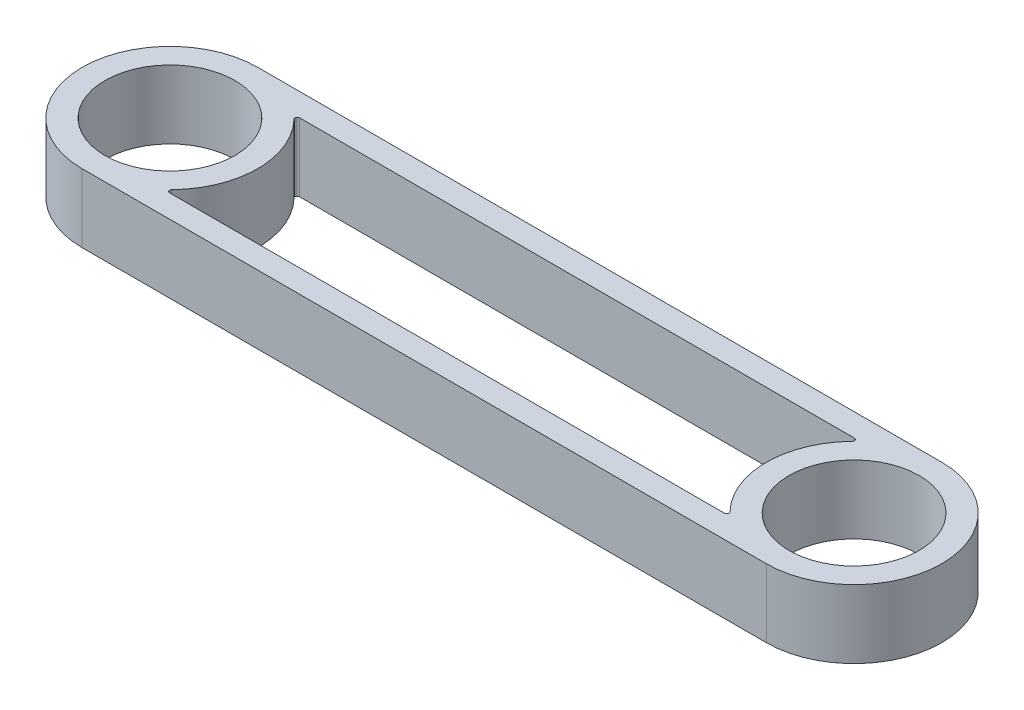
ISO-10303-21;
HEADER;
FILE_DESCRIPTION(('STEP AP214'),'2;1');
FILE_NAME('part.step','',(''),(''),'','','');
FILE_SCHEMA(('AUTOMOTIVE_DESIGN { 1 0 10303 214 1 1 1 1 }'));
ENDSEC;
DATA;
#1=APPLICATION_CONTEXT('core data for automotive mechanical design processes');
#2=APPLICATION_PROTOCOL_DEFINITION('international standard','automotive_design',2000,#1);
#3=PRODUCT_CONTEXT('',#1,'mechanical');
#4=PRODUCT('Part','Part','',(#3));
#5=PRODUCT_RELATED_PRODUCT_CATEGORY('part','',(#4));
#6=PRODUCT_DEFINITION_FORMATION('','',#4);
#7=PRODUCT_DEFINITION_CONTEXT('part definition',#1,'design');
#8=PRODUCT_DEFINITION('design','',#6,#7);
#9=PRODUCT_DEFINITION_SHAPE('','',#8);
#10=(LENGTH_UNIT() NAMED_UNIT(*) SI_UNIT(.MILLI.,.METRE.));
#11=(NAMED_UNIT(*) PLANE_ANGLE_UNIT() SI_UNIT($,.RADIAN.));
#12=(NAMED_UNIT(*) SI_UNIT($,.STERADIAN.) SOLID_ANGLE_UNIT());
#13=UNCERTAINTY_MEASURE_WITH_UNIT(LENGTH_MEASURE(1.E-05),#10,'distance_accuracy_value','');
#14=(GEOMETRIC_REPRESENTATION_CONTEXT(3) GLOBAL_UNCERTAINTY_ASSIGNED_CONTEXT((#13)) GLOBAL_UNIT_ASSIGNED_CONTEXT((#10,
#11,#12)) REPRESENTATION_CONTEXT('',''));
#15=CARTESIAN_POINT('',(0.,0.,0.));
#16=DIRECTION('',(0.,0.,1.));
#17=DIRECTION('',(1.,0.,0.));
#18=AXIS2_PLACEMENT_3D('',#15,#16,#17);
#19=CARTESIAN_POINT('',(0.,30.,0.));
#20=DIRECTION('',(0.,1.,0.));
#21=DIRECTION('',(0.,0.,1.));
#22=AXIS2_PLACEMENT_3D('',#19,#20,#21);
#23=PLANE('',#22);
#24=CARTESIAN_POINT('',(0.,30.,0.));
#25=DIRECTION('',(0.,-1.,0.));
#26=DIRECTION('',(0.,0.,1.));
#27=AXIS2_PLACEMENT_3D('',#24,#25,#26);
#28=CIRCLE('',#27,38.5);
#29=CARTESIAN_POINT('',(27.637048345933,30.,-26.8037974683544));
#30=VERTEX_POINT('',#29);
#31=CARTESIAN_POINT('',(27.637048345933,30.,26.8037974683544));
#32=VERTEX_POINT('',#31);
#33=EDGE_CURVE('E132',#30,#32,#28,.T.);
#34=ORIENTED_EDGE('',*,*,#33,.F.);
#35=CARTESIAN_POINT('',(28.3548937575157,30.,-27.5));
#36=DIRECTION('',(0.,1.,0.));
#37=DIRECTION('',(0.,0.,1.));
#38=AXIS2_PLACEMENT_3D('',#35,#36,#37);
#39=CIRCLE('',#38,1.);
#40=CARTESIAN_POINT('',(28.3548937575157,30.,-28.5));
#41=VERTEX_POINT('',#40);
#42=EDGE_CURVE('E124',#41,#30,#39,.T.);
#43=ORIENTED_EDGE('',*,*,#42,.F.);
#44=DIRECTION('',(-1.,0.,0.));
#45=VECTOR('',#44,1.);
#46=CARTESIAN_POINT('',(28.3548937575157,30.,-28.5));
#47=LINE('',#46,#45);
#48=CARTESIAN_POINT('',(271.645106242484,30.,-28.5));
#49=VERTEX_POINT('',#48);
#50=EDGE_CURVE('E159',#49,#41,#47,.T.);
#51=ORIENTED_EDGE('',*,*,#50,.F.);
#52=CARTESIAN_POINT('',(271.645106242484,30.,-27.5));
#53=DIRECTION('',(0.,1.,0.));
#54=DIRECTION('',(0.,0.,-1.));
#55=AXIS2_PLACEMENT_3D('',#52,#53,#54);
#56=CIRCLE('',#55,0.999999999999994);
#57=CARTESIAN_POINT('',(272.362951654067,30.,-26.8037974683544));
#58=VERTEX_POINT('',#57);
#59=EDGE_CURVE('E157',#58,#49,#56,.T.);
#60=ORIENTED_EDGE('',*,*,#59,.F.);
#61=CARTESIAN_POINT('',(300.,30.,0.));
#62=DIRECTION('',(0.,-1.,0.));
#63=DIRECTION('',(0.,0.,-1.));
#64=AXIS2_PLACEMENT_3D('',#61,#62,#63);
#65=CIRCLE('',#64,38.5);
#66=CARTESIAN_POINT('',(272.362951654067,30.,26.8037974683544));
#67=VERTEX_POINT('',#66);
#68=EDGE_CURVE('E155',#67,#58,#65,.T.);
#69=ORIENTED_EDGE('',*,*,#68,.F.);
#70=CARTESIAN_POINT('',(271.645106242484,30.,27.5));
#71=DIRECTION('',(0.,1.,0.));
#72=DIRECTION('',(0.,0.,-1.));
#73=AXIS2_PLACEMENT_3D('',#70,#71,#72);
#74=CIRCLE('',#73,0.999999999999994);
#75=CARTESIAN_POINT('',(271.645106242484,30.,28.5));
#76=VERTEX_POINT('',#75);
#77=EDGE_CURVE('E153',#76,#67,#74,.T.);
#78=ORIENTED_EDGE('',*,*,#77,.F.);
#79=DIRECTION('',(1.,0.,0.));
#80=VECTOR('',#79,1.);
#81=CARTESIAN_POINT('',(28.3548937575157,30.,28.5));
#82=LINE('',#81,#80);
#83=CARTESIAN_POINT('',(28.3548937575157,30.,28.5));
#84=VERTEX_POINT('',#83);
#85=EDGE_CURVE('E148',#84,#76,#82,.T.);
#86=ORIENTED_EDGE('',*,*,#85,.F.);
#87=CARTESIAN_POINT('',(28.3548937575157,30.,27.5));
#88=DIRECTION('',(0.,1.,0.));
#89=DIRECTION('',(0.,0.,1.));
#90=AXIS2_PLACEMENT_3D('',#87,#88,#89);
#91=CIRCLE('',#90,1.);
#92=EDGE_CURVE('E146',#32,#84,#91,.T.);
#93=ORIENTED_EDGE('',*,*,#92,.F.);
#94=EDGE_LOOP('',(#34,#43,#51,#60,#69,#78,#86,#93));
#95=FACE_BOUND('',#94,.T.);
#96=CARTESIAN_POINT('',(0.,30.,0.));
#97=DIRECTION('',(0.,1.,0.));
#98=DIRECTION('',(0.,0.,1.));
#99=AXIS2_PLACEMENT_3D('',#96,#97,#98);
#100=CIRCLE('',#99,28.5);
#101=CARTESIAN_POINT('',(0.,30.,28.5));
#102=VERTEX_POINT('',#101);
#103=EDGE_CURVE('E192',#102,#102,#100,.T.);
#104=ORIENTED_EDGE('',*,*,#103,.F.);
#105=EDGE_LOOP('',(#104));
#106=FACE_BOUND('',#105,.T.);
#107=CARTESIAN_POINT('',(0.,30.,0.));
#108=DIRECTION('',(0.,1.,0.));
#109=DIRECTION('',(0.,0.,1.));
#110=AXIS2_PLACEMENT_3D('',#107,#108,#109);
#111=CIRCLE('',#110,38.5);
#112=CARTESIAN_POINT('',(0.,30.,-38.5));
#113=VERTEX_POINT('',#112);
#114=CARTESIAN_POINT('',(0.,30.,38.5));
#115=VERTEX_POINT('',#114);
#116=EDGE_CURVE('E198',#113,#115,#111,.T.);
#117=ORIENTED_EDGE('',*,*,#116,.T.);
#118=DIRECTION('',(1.,0.,0.));
#119=VECTOR('',#118,1.);
#120=CARTESIAN_POINT('',(0.,30.,38.5));
#121=LINE('',#120,#119);
#122=CARTESIAN_POINT('',(300.,30.,38.5));
#123=VERTEX_POINT('',#122);
#124=EDGE_CURVE('E201',#115,#123,#121,.T.);
#125=ORIENTED_EDGE('',*,*,#124,.T.);
#126=CARTESIAN_POINT('',(300.,30.,0.));
#127=DIRECTION('',(0.,1.,0.));
#128=DIRECTION('',(0.,0.,-1.));
#129=AXIS2_PLACEMENT_3D('',#126,#127,#128);
#130=CIRCLE('',#129,38.5);
#131=CARTESIAN_POINT('',(300.,30.,-38.5000000000001));
#132=VERTEX_POINT('',#131);
#133=EDGE_CURVE('E204',#123,#132,#130,.T.);
#134=ORIENTED_EDGE('',*,*,#133,.T.);
#135=DIRECTION('',(-1.,0.,0.));
#136=VECTOR('',#135,1.);
#137=CARTESIAN_POINT('',(0.,30.,-38.5));
#138=LINE('',#137,#136);
#139=EDGE_CURVE('E206',#132,#113,#138,.T.);
#140=ORIENTED_EDGE('',*,*,#139,.T.);
#141=EDGE_LOOP('',(#117,#125,#134,#140));
#142=FACE_BOUND('',#141,.T.);
#143=CARTESIAN_POINT('',(300.,30.,0.));
#144=DIRECTION('',(0.,1.,0.));
#145=DIRECTION('',(0.,0.,-1.));
#146=AXIS2_PLACEMENT_3D('',#143,#144,#145);
#147=CIRCLE('',#146,28.5);
#148=CARTESIAN_POINT('',(300.,30.,-28.5000000000001));
#149=VERTEX_POINT('',#148);
#150=EDGE_CURVE('E162',#149,#149,#147,.T.);
#151=ORIENTED_EDGE('',*,*,#150,.F.);
#152=EDGE_LOOP('',(#151));
#153=FACE_BOUND('',#152,.T.);
#154=ADVANCED_FACE('F35',(#95,#106,#142,#153),#23,.T.);
#155=CARTESIAN_POINT('',(0.,0.,0.));
#156=DIRECTION('',(0.,1.,0.));
#157=DIRECTION('',(0.,0.,1.));
#158=AXIS2_PLACEMENT_3D('',#155,#156,#157);
#159=PLANE('',#158);
#160=CARTESIAN_POINT('',(0.,0.,0.));
#161=DIRECTION('',(0.,1.,0.));
#162=DIRECTION('',(0.,0.,1.));
#163=AXIS2_PLACEMENT_3D('',#160,#161,#162);
#164=CIRCLE('',#163,28.5);
#165=CARTESIAN_POINT('',(0.,0.,28.5));
#166=VERTEX_POINT('',#165);
#167=EDGE_CURVE('E140',#166,#166,#164,.T.);
#168=ORIENTED_EDGE('',*,*,#167,.T.);
#169=EDGE_LOOP('',(#168));
#170=FACE_BOUND('',#169,.T.);
#171=CARTESIAN_POINT('',(0.,0.,0.));
#172=DIRECTION('',(0.,1.,0.));
#173=DIRECTION('',(0.,0.,1.));
#174=AXIS2_PLACEMENT_3D('',#171,#172,#173);
#175=CIRCLE('',#174,38.5);
#176=CARTESIAN_POINT('',(0.,0.,-38.5));
#177=VERTEX_POINT('',#176);
#178=CARTESIAN_POINT('',(0.,0.,38.5));
#179=VERTEX_POINT('',#178);
#180=EDGE_CURVE('E195',#177,#179,#175,.T.);
#181=ORIENTED_EDGE('',*,*,#180,.F.);
#182=DIRECTION('',(-1.,0.,0.));
#183=VECTOR('',#182,1.);
#184=CARTESIAN_POINT('',(0.,0.,-38.5));
#185=LINE('',#184,#183);
#186=CARTESIAN_POINT('',(300.,0.,-38.5000000000001));
#187=VERTEX_POINT('',#186);
#188=EDGE_CURVE('E202',#187,#177,#185,.T.);
#189=ORIENTED_EDGE('',*,*,#188,.F.);
#190=CARTESIAN_POINT('',(300.,0.,0.));
#191=DIRECTION('',(0.,1.,0.));
#192=DIRECTION('',(0.,0.,-1.));
#193=AXIS2_PLACEMENT_3D('',#190,#191,#192);
#194=CIRCLE('',#193,38.5);
#195=CARTESIAN_POINT('',(300.,0.,38.5));
#196=VERTEX_POINT('',#195);
#197=EDGE_CURVE('E213',#196,#187,#194,.T.);
#198=ORIENTED_EDGE('',*,*,#197,.F.);
#199=DIRECTION('',(1.,0.,0.));
#200=VECTOR('',#199,1.);
#201=CARTESIAN_POINT('',(0.,0.,38.5));
#202=LINE('',#201,#200);
#203=EDGE_CURVE('E211',#179,#196,#202,.T.);
#204=ORIENTED_EDGE('',*,*,#203,.F.);
#205=EDGE_LOOP('',(#181,#189,#198,#204));
#206=FACE_BOUND('',#205,.T.);
#207=CARTESIAN_POINT('',(28.3548937575157,0.,-27.5));
#208=DIRECTION('',(0.,1.,0.));
#209=DIRECTION('',(0.,0.,1.));
#210=AXIS2_PLACEMENT_3D('',#207,#208,#209);
#211=CIRCLE('',#210,1.);
#212=CARTESIAN_POINT('',(28.3548937575157,0.,-28.5));
#213=VERTEX_POINT('',#212);
#214=CARTESIAN_POINT('',(27.637048345933,0.,-26.8037974683544));
#215=VERTEX_POINT('',#214);
#216=EDGE_CURVE('E58',#213,#215,#211,.T.);
#217=ORIENTED_EDGE('',*,*,#216,.T.);
#218=CARTESIAN_POINT('',(0.,0.,0.));
#219=DIRECTION('',(0.,-1.,0.));
#220=DIRECTION('',(0.,0.,1.));
#221=AXIS2_PLACEMENT_3D('',#218,#219,#220);
#222=CIRCLE('',#221,38.5);
#223=CARTESIAN_POINT('',(27.637048345933,0.,26.8037974683544));
#224=VERTEX_POINT('',#223);
#225=EDGE_CURVE('E139',#215,#224,#222,.T.);
#226=ORIENTED_EDGE('',*,*,#225,.T.);
#227=CARTESIAN_POINT('',(28.3548937575157,0.,27.5));
#228=DIRECTION('',(0.,1.,0.));
#229=DIRECTION('',(0.,0.,1.));
#230=AXIS2_PLACEMENT_3D('',#227,#228,#229);
#231=CIRCLE('',#230,1.);
#232=CARTESIAN_POINT('',(28.3548937575157,0.,28.5));
#233=VERTEX_POINT('',#232);
#234=EDGE_CURVE('E164',#224,#233,#231,.T.);
#235=ORIENTED_EDGE('',*,*,#234,.T.);
#236=DIRECTION('',(1.,0.,0.));
#237=VECTOR('',#236,1.);
#238=CARTESIAN_POINT('',(28.3548937575157,0.,28.5));
#239=LINE('',#238,#237);
#240=CARTESIAN_POINT('',(271.645106242484,0.,28.5));
#241=VERTEX_POINT('',#240);
#242=EDGE_CURVE('E167',#233,#241,#239,.T.);
#243=ORIENTED_EDGE('',*,*,#242,.T.);
#244=CARTESIAN_POINT('',(271.645106242484,0.,27.5));
#245=DIRECTION('',(0.,1.,0.));
#246=DIRECTION('',(0.,0.,-1.));
#247=AXIS2_PLACEMENT_3D('',#244,#245,#246);
#248=CIRCLE('',#247,0.999999999999994);
#249=CARTESIAN_POINT('',(272.362951654067,0.,26.8037974683544));
#250=VERTEX_POINT('',#249);
#251=EDGE_CURVE('E170',#241,#250,#248,.T.);
#252=ORIENTED_EDGE('',*,*,#251,.T.);
#253=CARTESIAN_POINT('',(300.,0.,0.));
#254=DIRECTION('',(0.,-1.,0.));
#255=DIRECTION('',(0.,0.,-1.));
#256=AXIS2_PLACEMENT_3D('',#253,#254,#255);
#257=CIRCLE('',#256,38.5);
#258=CARTESIAN_POINT('',(272.362951654067,0.,-26.8037974683544));
#259=VERTEX_POINT('',#258);
#260=EDGE_CURVE('E173',#250,#259,#257,.T.);
#261=ORIENTED_EDGE('',*,*,#260,.T.);
#262=CARTESIAN_POINT('',(271.645106242484,0.,-27.5));
#263=DIRECTION('',(0.,1.,0.));
#264=DIRECTION('',(0.,0.,-1.));
#265=AXIS2_PLACEMENT_3D('',#262,#263,#264);
#266=CIRCLE('',#265,0.999999999999994);
#267=CARTESIAN_POINT('',(271.645106242484,0.,-28.5));
#268=VERTEX_POINT('',#267);
#269=EDGE_CURVE('E176',#259,#268,#266,.T.);
#270=ORIENTED_EDGE('',*,*,#269,.T.);
#271=DIRECTION('',(-1.,0.,0.));
#272=VECTOR('',#271,1.);
#273=CARTESIAN_POINT('',(28.3548937575157,0.,-28.5));
#274=LINE('',#273,#272);
#275=EDGE_CURVE('E133',#268,#213,#274,.T.);
#276=ORIENTED_EDGE('',*,*,#275,.T.);
#277=EDGE_LOOP('',(#217,#226,#235,#243,#252,#261,#270,#276));
#278=FACE_BOUND('',#277,.T.);
#279=CARTESIAN_POINT('',(300.,0.,0.));
#280=DIRECTION('',(0.,1.,0.));
#281=DIRECTION('',(0.,0.,-1.));
#282=AXIS2_PLACEMENT_3D('',#279,#280,#281);
#283=CIRCLE('',#282,28.5);
#284=CARTESIAN_POINT('',(300.,0.,-28.5000000000001));
#285=VERTEX_POINT('',#284);
#286=EDGE_CURVE('E309',#285,#285,#283,.T.);
#287=ORIENTED_EDGE('',*,*,#286,.T.);
#288=EDGE_LOOP('',(#287));
#289=FACE_BOUND('',#288,.T.);
#290=ADVANCED_FACE('F231',(#170,#206,#278,#289),#159,.F.);
#291=CARTESIAN_POINT('',(0.,30.,0.));
#292=DIRECTION('',(0.,-1.,0.));
#293=DIRECTION('',(0.,0.,-1.));
#294=AXIS2_PLACEMENT_3D('',#291,#292,#293);
#295=CYLINDRICAL_SURFACE('',#294,38.5);
#296=ORIENTED_EDGE('',*,*,#180,.T.);
#297=DIRECTION('',(0.,-1.,0.));
#298=VECTOR('',#297,1.);
#299=CARTESIAN_POINT('',(0.,30.,38.5));
#300=LINE('',#299,#298);
#301=EDGE_CURVE('E11',#115,#179,#300,.T.);
#302=ORIENTED_EDGE('',*,*,#301,.F.);
#303=ORIENTED_EDGE('',*,*,#116,.F.);
#304=DIRECTION('',(0.,-1.,0.));
#305=VECTOR('',#304,1.);
#306=CARTESIAN_POINT('',(0.,30.,-38.5));
#307=LINE('',#306,#305);
#308=EDGE_CURVE('E208',#113,#177,#307,.T.);
#309=ORIENTED_EDGE('',*,*,#308,.T.);
#310=EDGE_LOOP('',(#296,#302,#303,#309));
#311=FACE_BOUND('',#310,.T.);
#312=ADVANCED_FACE('F37',(#311),#295,.T.);
#313=CARTESIAN_POINT('',(0.,30.,38.5));
#314=DIRECTION('',(0.,0.,-1.));
#315=DIRECTION('',(-1.,0.,0.));
#316=AXIS2_PLACEMENT_3D('',#313,#314,#315);
#317=PLANE('',#316);
#318=ORIENTED_EDGE('',*,*,#203,.T.);
#319=DIRECTION('',(0.,-1.,0.));
#320=VECTOR('',#319,1.);
#321=CARTESIAN_POINT('',(300.,30.,38.5));
#322=LINE('',#321,#320);
#323=EDGE_CURVE('E43',#123,#196,#322,.T.);
#324=ORIENTED_EDGE('',*,*,#323,.F.);
#325=ORIENTED_EDGE('',*,*,#124,.F.);
#326=ORIENTED_EDGE('',*,*,#301,.T.);
#327=EDGE_LOOP('',(#318,#324,#325,#326));
#328=FACE_BOUND('',#327,.T.);
#329=ADVANCED_FACE('F242',(#328),#317,.F.);
#330=CARTESIAN_POINT('',(300.,30.,0.));
#331=DIRECTION('',(0.,-1.,0.));
#332=DIRECTION('',(0.,0.,-1.));
#333=AXIS2_PLACEMENT_3D('',#330,#331,#332);
#334=CYLINDRICAL_SURFACE('',#333,38.5);
#335=ORIENTED_EDGE('',*,*,#197,.T.);
#336=DIRECTION('',(0.,-1.,0.));
#337=VECTOR('',#336,1.);
#338=CARTESIAN_POINT('',(300.,30.,-38.5000000000001));
#339=LINE('',#338,#337);
#340=EDGE_CURVE('E218',#132,#187,#339,.T.);
#341=ORIENTED_EDGE('',*,*,#340,.F.);
#342=ORIENTED_EDGE('',*,*,#133,.F.);
#343=ORIENTED_EDGE('',*,*,#323,.T.);
#344=EDGE_LOOP('',(#335,#341,#342,#343));
#345=FACE_BOUND('',#344,.T.);
#346=ADVANCED_FACE('F225',(#345),#334,.T.);
#347=CARTESIAN_POINT('',(0.,30.,-38.5));
#348=DIRECTION('',(0.,0.,1.));
#349=DIRECTION('',(1.,0.,0.));
#350=AXIS2_PLACEMENT_3D('',#347,#348,#349);
#351=PLANE('',#350);
#352=ORIENTED_EDGE('',*,*,#188,.T.);
#353=ORIENTED_EDGE('',*,*,#308,.F.);
#354=ORIENTED_EDGE('',*,*,#139,.F.);
#355=ORIENTED_EDGE('',*,*,#340,.T.);
#356=EDGE_LOOP('',(#352,#353,#354,#355));
#357=FACE_BOUND('',#356,.T.);
#358=ADVANCED_FACE('F235',(#357),#351,.F.);
#359=CARTESIAN_POINT('',(0.,30.,0.));
#360=DIRECTION('',(0.,-1.,0.));
#361=DIRECTION('',(0.,0.,-1.));
#362=AXIS2_PLACEMENT_3D('',#359,#360,#361);
#363=CYLINDRICAL_SURFACE('',#362,28.5);
#364=ORIENTED_EDGE('',*,*,#103,.T.);
#365=EDGE_LOOP('',(#364));
#366=FACE_BOUND('',#365,.T.);
#367=ORIENTED_EDGE('',*,*,#167,.F.);
#368=EDGE_LOOP('',(#367));
#369=FACE_BOUND('',#368,.T.);
#370=ADVANCED_FACE('F257',(#366,#369),#363,.F.);
#371=CARTESIAN_POINT('',(28.3548937575157,30.,-27.5));
#372=DIRECTION('',(0.,-1.,0.));
#373=DIRECTION('',(0.,0.,-1.));
#374=AXIS2_PLACEMENT_3D('',#371,#372,#373);
#375=CYLINDRICAL_SURFACE('',#374,1.);
#376=ORIENTED_EDGE('',*,*,#216,.F.);
#377=DIRECTION('',(0.,-1.,0.));
#378=VECTOR('',#377,1.);
#379=CARTESIAN_POINT('',(28.3548937575157,30.,-28.5));
#380=LINE('',#379,#378);
#381=EDGE_CURVE('E128',#41,#213,#380,.T.);
#382=ORIENTED_EDGE('',*,*,#381,.F.);
#383=ORIENTED_EDGE('',*,*,#42,.T.);
#384=DIRECTION('',(0.,-1.,0.));
#385=VECTOR('',#384,1.);
#386=CARTESIAN_POINT('',(27.637048345933,30.,-26.8037974683544));
#387=LINE('',#386,#385);
#388=EDGE_CURVE('E127',#30,#215,#387,.T.);
#389=ORIENTED_EDGE('',*,*,#388,.T.);
#390=EDGE_LOOP('',(#376,#382,#383,#389));
#391=FACE_BOUND('',#390,.T.);
#392=ADVANCED_FACE('F126',(#391),#375,.F.);
#393=CARTESIAN_POINT('',(0.,30.,0.));
#394=DIRECTION('',(0.,-1.,0.));
#395=DIRECTION('',(0.,0.,-1.));
#396=AXIS2_PLACEMENT_3D('',#393,#394,#395);
#397=CYLINDRICAL_SURFACE('',#396,38.5);
#398=ORIENTED_EDGE('',*,*,#225,.F.);
#399=ORIENTED_EDGE('',*,*,#388,.F.);
#400=ORIENTED_EDGE('',*,*,#33,.T.);
#401=DIRECTION('',(0.,-1.,0.));
#402=VECTOR('',#401,1.);
#403=CARTESIAN_POINT('',(27.637048345933,30.,26.8037974683544));
#404=LINE('',#403,#402);
#405=EDGE_CURVE('E141',#32,#224,#404,.T.);
#406=ORIENTED_EDGE('',*,*,#405,.T.);
#407=EDGE_LOOP('',(#398,#399,#400,#406));
#408=FACE_BOUND('',#407,.T.);
#409=ADVANCED_FACE('F136',(#408),#397,.T.);
#410=CARTESIAN_POINT('',(28.3548937575157,30.,27.5));
#411=DIRECTION('',(0.,-1.,0.));
#412=DIRECTION('',(0.,0.,-1.));
#413=AXIS2_PLACEMENT_3D('',#410,#411,#412);
#414=CYLINDRICAL_SURFACE('',#413,1.);
#415=ORIENTED_EDGE('',*,*,#234,.F.);
#416=ORIENTED_EDGE('',*,*,#405,.F.);
#417=ORIENTED_EDGE('',*,*,#92,.T.);
#418=DIRECTION('',(0.,-1.,0.));
#419=VECTOR('',#418,1.);
#420=CARTESIAN_POINT('',(28.3548937575157,30.,28.5));
#421=LINE('',#420,#419);
#422=EDGE_CURVE('E189',#84,#233,#421,.T.);
#423=ORIENTED_EDGE('',*,*,#422,.T.);
#424=EDGE_LOOP('',(#415,#416,#417,#423));
#425=FACE_BOUND('',#424,.T.);
#426=ADVANCED_FACE('F274',(#425),#414,.F.);
#427=CARTESIAN_POINT('',(28.3548937575157,30.,28.5));
#428=DIRECTION('',(0.,0.,-1.));
#429=DIRECTION('',(-1.,0.,0.));
#430=AXIS2_PLACEMENT_3D('',#427,#428,#429);
#431=PLANE('',#430);
#432=ORIENTED_EDGE('',*,*,#242,.F.);
#433=ORIENTED_EDGE('',*,*,#422,.F.);
#434=ORIENTED_EDGE('',*,*,#85,.T.);
#435=DIRECTION('',(0.,-1.,0.));
#436=VECTOR('',#435,1.);
#437=CARTESIAN_POINT('',(271.645106242484,30.,28.5));
#438=LINE('',#437,#436);
#439=EDGE_CURVE('E187',#76,#241,#438,.T.);
#440=ORIENTED_EDGE('',*,*,#439,.T.);
#441=EDGE_LOOP('',(#432,#433,#434,#440));
#442=FACE_BOUND('',#441,.T.);
#443=ADVANCED_FACE('F279',(#442),#431,.T.);
#444=CARTESIAN_POINT('',(271.645106242484,30.,27.5));
#445=DIRECTION('',(0.,-1.,0.));
#446=DIRECTION('',(0.,0.,-1.));
#447=AXIS2_PLACEMENT_3D('',#444,#445,#446);
#448=CYLINDRICAL_SURFACE('',#447,0.999999999999994);
#449=ORIENTED_EDGE('',*,*,#251,.F.);
#450=ORIENTED_EDGE('',*,*,#439,.F.);
#451=ORIENTED_EDGE('',*,*,#77,.T.);
#452=DIRECTION('',(0.,-1.,0.));
#453=VECTOR('',#452,1.);
#454=CARTESIAN_POINT('',(272.362951654067,30.,26.8037974683544));
#455=LINE('',#454,#453);
#456=EDGE_CURVE('E185',#67,#250,#455,.T.);
#457=ORIENTED_EDGE('',*,*,#456,.T.);
#458=EDGE_LOOP('',(#449,#450,#451,#457));
#459=FACE_BOUND('',#458,.T.);
#460=ADVANCED_FACE('F283',(#459),#448,.F.);
#461=CARTESIAN_POINT('',(300.,30.,0.));
#462=DIRECTION('',(0.,-1.,0.));
#463=DIRECTION('',(0.,0.,-1.));
#464=AXIS2_PLACEMENT_3D('',#461,#462,#463);
#465=CYLINDRICAL_SURFACE('',#464,38.5);
#466=ORIENTED_EDGE('',*,*,#260,.F.);
#467=ORIENTED_EDGE('',*,*,#456,.F.);
#468=ORIENTED_EDGE('',*,*,#68,.T.);
#469=DIRECTION('',(0.,-1.,0.));
#470=VECTOR('',#469,1.);
#471=CARTESIAN_POINT('',(272.362951654067,30.,-26.8037974683544));
#472=LINE('',#471,#470);
#473=EDGE_CURVE('E183',#58,#259,#472,.T.);
#474=ORIENTED_EDGE('',*,*,#473,.T.);
#475=EDGE_LOOP('',(#466,#467,#468,#474));
#476=FACE_BOUND('',#475,.T.);
#477=ADVANCED_FACE('F287',(#476),#465,.T.);
#478=CARTESIAN_POINT('',(271.645106242484,30.,-27.5));
#479=DIRECTION('',(0.,-1.,0.));
#480=DIRECTION('',(0.,0.,-1.));
#481=AXIS2_PLACEMENT_3D('',#478,#479,#480);
#482=CYLINDRICAL_SURFACE('',#481,0.999999999999994);
#483=ORIENTED_EDGE('',*,*,#269,.F.);
#484=ORIENTED_EDGE('',*,*,#473,.F.);
#485=ORIENTED_EDGE('',*,*,#59,.T.);
#486=DIRECTION('',(0.,-1.,0.));
#487=VECTOR('',#486,1.);
#488=CARTESIAN_POINT('',(271.645106242484,30.,-28.5));
#489=LINE('',#488,#487);
#490=EDGE_CURVE('E50',#49,#268,#489,.T.);
#491=ORIENTED_EDGE('',*,*,#490,.T.);
#492=EDGE_LOOP('',(#483,#484,#485,#491));
#493=FACE_BOUND('',#492,.T.);
#494=ADVANCED_FACE('F291',(#493),#482,.F.);
#495=CARTESIAN_POINT('',(28.3548937575157,30.,-28.5));
#496=DIRECTION('',(0.,0.,1.));
#497=DIRECTION('',(1.,0.,0.));
#498=AXIS2_PLACEMENT_3D('',#495,#496,#497);
#499=PLANE('',#498);
#500=ORIENTED_EDGE('',*,*,#275,.F.);
#501=ORIENTED_EDGE('',*,*,#490,.F.);
#502=ORIENTED_EDGE('',*,*,#50,.T.);
#503=ORIENTED_EDGE('',*,*,#381,.T.);
#504=EDGE_LOOP('',(#500,#501,#502,#503));
#505=FACE_BOUND('',#504,.T.);
#506=ADVANCED_FACE('F295',(#505),#499,.T.);
#507=CARTESIAN_POINT('',(300.,30.,0.));
#508=DIRECTION('',(0.,-1.,0.));
#509=DIRECTION('',(0.,0.,-1.));
#510=AXIS2_PLACEMENT_3D('',#507,#508,#509);
#511=CYLINDRICAL_SURFACE('',#510,28.5);
#512=ORIENTED_EDGE('',*,*,#150,.T.);
#513=EDGE_LOOP('',(#512));
#514=FACE_BOUND('',#513,.T.);
#515=ORIENTED_EDGE('',*,*,#286,.F.);
#516=EDGE_LOOP('',(#515));
#517=FACE_BOUND('',#516,.T.);
#518=ADVANCED_FACE('F299',(#514,#517),#511,.F.);
#519=CLOSED_SHELL('',(#154,#290,#312,#329,#346,#358,#370,#392,#409,#426,#443,#460,#477,#494,
#506,#518));
#520=MANIFOLD_SOLID_BREP('B2',#519);
#521=ADVANCED_BREP_SHAPE_REPRESENTATION('',(#18,#520),#14);
#522=SHAPE_DEFINITION_REPRESENTATION(#9,#521);
ENDSEC;
END-ISO-10303-21;
